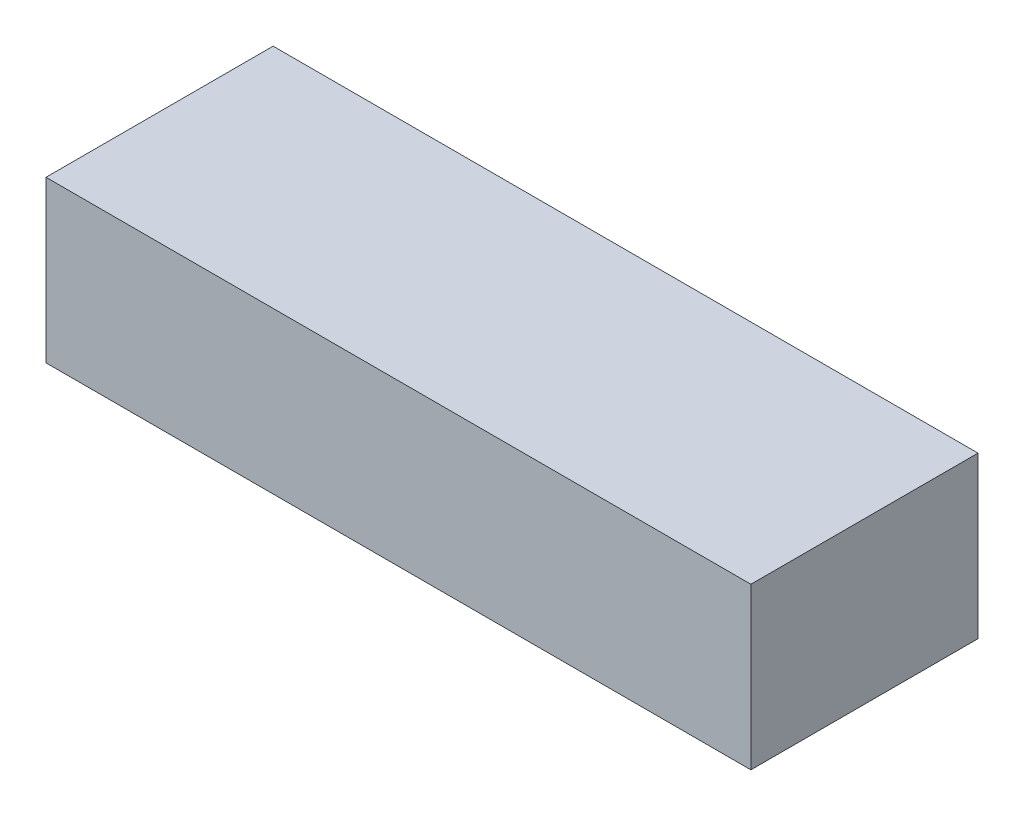
ISO-10303-21;
HEADER;
FILE_DESCRIPTION(('STEP AP214'),'2;1');
FILE_NAME('part.step','',(''),(''),'','','');
FILE_SCHEMA(('AUTOMOTIVE_DESIGN { 1 0 10303 214 1 1 1 1 }'));
ENDSEC;
DATA;
#1=APPLICATION_CONTEXT('core data for automotive mechanical design processes');
#2=APPLICATION_PROTOCOL_DEFINITION('international standard','automotive_design',2000,#1);
#3=PRODUCT_CONTEXT('',#1,'mechanical');
#4=PRODUCT('Part','Part','',(#3));
#5=PRODUCT_RELATED_PRODUCT_CATEGORY('part','',(#4));
#6=PRODUCT_DEFINITION_FORMATION('','',#4);
#7=PRODUCT_DEFINITION_CONTEXT('part definition',#1,'design');
#8=PRODUCT_DEFINITION('design','',#6,#7);
#9=PRODUCT_DEFINITION_SHAPE('','',#8);
#10=(LENGTH_UNIT() NAMED_UNIT(*) SI_UNIT(.MILLI.,.METRE.));
#11=(NAMED_UNIT(*) PLANE_ANGLE_UNIT() SI_UNIT($,.RADIAN.));
#12=(NAMED_UNIT(*) SI_UNIT($,.STERADIAN.) SOLID_ANGLE_UNIT());
#13=UNCERTAINTY_MEASURE_WITH_UNIT(LENGTH_MEASURE(1.E-05),#10,'distance_accuracy_value','');
#14=(GEOMETRIC_REPRESENTATION_CONTEXT(3) GLOBAL_UNCERTAINTY_ASSIGNED_CONTEXT((#13)) GLOBAL_UNIT_ASSIGNED_CONTEXT((#10,
#11,#12)) REPRESENTATION_CONTEXT('',''));
#15=CARTESIAN_POINT('',(0.,0.,0.));
#16=DIRECTION('',(0.,0.,1.));
#17=DIRECTION('',(1.,0.,0.));
#18=AXIS2_PLACEMENT_3D('',#15,#16,#17);
#19=CARTESIAN_POINT('',(67.97,31.,-21.9));
#20=DIRECTION('',(-1.,0.,0.));
#21=DIRECTION('',(0.,0.,1.));
#22=AXIS2_PLACEMENT_3D('',#19,#20,#21);
#23=PLANE('',#22);
#24=DIRECTION('',(0.,0.,-1.));
#25=VECTOR('',#24,1.);
#26=CARTESIAN_POINT('',(67.97,0.,-21.9));
#27=LINE('',#26,#25);
#28=CARTESIAN_POINT('',(67.97,0.,21.9));
#29=VERTEX_POINT('',#28);
#30=CARTESIAN_POINT('',(67.97,0.,-21.9));
#31=VERTEX_POINT('',#30);
#32=EDGE_CURVE('E100',#29,#31,#27,.T.);
#33=ORIENTED_EDGE('',*,*,#32,.T.);
#34=DIRECTION('',(0.,-1.,0.));
#35=VECTOR('',#34,1.);
#36=CARTESIAN_POINT('',(67.97,31.,-21.9));
#37=LINE('',#36,#35);
#38=CARTESIAN_POINT('',(67.97,31.,-21.9));
#39=VERTEX_POINT('',#38);
#40=EDGE_CURVE('E11',#39,#31,#37,.T.);
#41=ORIENTED_EDGE('',*,*,#40,.F.);
#42=DIRECTION('',(0.,0.,-1.));
#43=VECTOR('',#42,1.);
#44=CARTESIAN_POINT('',(67.97,31.,-21.9));
#45=LINE('',#44,#43);
#46=CARTESIAN_POINT('',(67.97,31.,21.9));
#47=VERTEX_POINT('',#46);
#48=EDGE_CURVE('E88',#47,#39,#45,.T.);
#49=ORIENTED_EDGE('',*,*,#48,.F.);
#50=DIRECTION('',(0.,-1.,0.));
#51=VECTOR('',#50,1.);
#52=CARTESIAN_POINT('',(67.97,31.,21.9));
#53=LINE('',#52,#51);
#54=EDGE_CURVE('E96',#47,#29,#53,.T.);
#55=ORIENTED_EDGE('',*,*,#54,.T.);
#56=EDGE_LOOP('',(#33,#41,#49,#55));
#57=FACE_BOUND('',#56,.T.);
#58=ADVANCED_FACE('F37',(#57),#23,.F.);
#59=CARTESIAN_POINT('',(-67.97,31.,-21.9));
#60=DIRECTION('',(0.,0.,1.));
#61=DIRECTION('',(1.,0.,0.));
#62=AXIS2_PLACEMENT_3D('',#59,#60,#61);
#63=PLANE('',#62);
#64=DIRECTION('',(-1.,0.,0.));
#65=VECTOR('',#64,1.);
#66=CARTESIAN_POINT('',(-67.97,0.,-21.9));
#67=LINE('',#66,#65);
#68=CARTESIAN_POINT('',(-67.97,0.,-21.9));
#69=VERTEX_POINT('',#68);
#70=EDGE_CURVE('E92',#31,#69,#67,.T.);
#71=ORIENTED_EDGE('',*,*,#70,.T.);
#72=DIRECTION('',(0.,-1.,0.));
#73=VECTOR('',#72,1.);
#74=CARTESIAN_POINT('',(-67.97,31.,-21.9));
#75=LINE('',#74,#73);
#76=CARTESIAN_POINT('',(-67.97,31.,-21.9));
#77=VERTEX_POINT('',#76);
#78=EDGE_CURVE('E45',#77,#69,#75,.T.);
#79=ORIENTED_EDGE('',*,*,#78,.F.);
#80=DIRECTION('',(-1.,0.,0.));
#81=VECTOR('',#80,1.);
#82=CARTESIAN_POINT('',(-67.97,31.,-21.9));
#83=LINE('',#82,#81);
#84=EDGE_CURVE('E83',#39,#77,#83,.T.);
#85=ORIENTED_EDGE('',*,*,#84,.F.);
#86=ORIENTED_EDGE('',*,*,#40,.T.);
#87=EDGE_LOOP('',(#71,#79,#85,#86));
#88=FACE_BOUND('',#87,.T.);
#89=ADVANCED_FACE('F91',(#88),#63,.F.);
#90=CARTESIAN_POINT('',(-67.97,31.,-21.9));
#91=DIRECTION('',(1.,0.,0.));
#92=DIRECTION('',(0.,0.,-1.));
#93=AXIS2_PLACEMENT_3D('',#90,#91,#92);
#94=PLANE('',#93);
#95=DIRECTION('',(0.,0.,1.));
#96=VECTOR('',#95,1.);
#97=CARTESIAN_POINT('',(-67.97,0.,-21.9));
#98=LINE('',#97,#96);
#99=CARTESIAN_POINT('',(-67.97,0.,21.9));
#100=VERTEX_POINT('',#99);
#101=EDGE_CURVE('E70',#69,#100,#98,.T.);
#102=ORIENTED_EDGE('',*,*,#101,.T.);
#103=DIRECTION('',(0.,-1.,0.));
#104=VECTOR('',#103,1.);
#105=CARTESIAN_POINT('',(-67.97,31.,21.9));
#106=LINE('',#105,#104);
#107=CARTESIAN_POINT('',(-67.97,31.,21.9));
#108=VERTEX_POINT('',#107);
#109=EDGE_CURVE('E93',#108,#100,#106,.T.);
#110=ORIENTED_EDGE('',*,*,#109,.F.);
#111=DIRECTION('',(0.,0.,1.));
#112=VECTOR('',#111,1.);
#113=CARTESIAN_POINT('',(-67.97,31.,-21.9));
#114=LINE('',#113,#112);
#115=EDGE_CURVE('E86',#77,#108,#114,.T.);
#116=ORIENTED_EDGE('',*,*,#115,.F.);
#117=ORIENTED_EDGE('',*,*,#78,.T.);
#118=EDGE_LOOP('',(#102,#110,#116,#117));
#119=FACE_BOUND('',#118,.T.);
#120=ADVANCED_FACE('F94',(#119),#94,.F.);
#121=CARTESIAN_POINT('',(-67.97,31.,21.9));
#122=DIRECTION('',(0.,0.,-1.));
#123=DIRECTION('',(-1.,0.,0.));
#124=AXIS2_PLACEMENT_3D('',#121,#122,#123);
#125=PLANE('',#124);
#126=DIRECTION('',(1.,0.,0.));
#127=VECTOR('',#126,1.);
#128=CARTESIAN_POINT('',(-67.97,0.,21.9));
#129=LINE('',#128,#127);
#130=EDGE_CURVE('E76',#100,#29,#129,.T.);
#131=ORIENTED_EDGE('',*,*,#130,.T.);
#132=ORIENTED_EDGE('',*,*,#54,.F.);
#133=DIRECTION('',(1.,0.,0.));
#134=VECTOR('',#133,1.);
#135=CARTESIAN_POINT('',(-67.97,31.,21.9));
#136=LINE('',#135,#134);
#137=EDGE_CURVE('E53',#108,#47,#136,.T.);
#138=ORIENTED_EDGE('',*,*,#137,.F.);
#139=ORIENTED_EDGE('',*,*,#109,.T.);
#140=EDGE_LOOP('',(#131,#132,#138,#139));
#141=FACE_BOUND('',#140,.T.);
#142=ADVANCED_FACE('F107',(#141),#125,.F.);
#143=CARTESIAN_POINT('',(0.,31.,0.));
#144=DIRECTION('',(0.,1.,0.));
#145=DIRECTION('',(0.,0.,1.));
#146=AXIS2_PLACEMENT_3D('',#143,#144,#145);
#147=PLANE('',#146);
#148=ORIENTED_EDGE('',*,*,#48,.T.);
#149=ORIENTED_EDGE('',*,*,#84,.T.);
#150=ORIENTED_EDGE('',*,*,#115,.T.);
#151=ORIENTED_EDGE('',*,*,#137,.T.);
#152=EDGE_LOOP('',(#148,#149,#150,#151));
#153=FACE_BOUND('',#152,.T.);
#154=ADVANCED_FACE('F84',(#153),#147,.T.);
#155=CARTESIAN_POINT('',(0.,0.,0.));
#156=DIRECTION('',(0.,1.,0.));
#157=DIRECTION('',(0.,0.,1.));
#158=AXIS2_PLACEMENT_3D('',#155,#156,#157);
#159=PLANE('',#158);
#160=ORIENTED_EDGE('',*,*,#32,.F.);
#161=ORIENTED_EDGE('',*,*,#130,.F.);
#162=ORIENTED_EDGE('',*,*,#101,.F.);
#163=ORIENTED_EDGE('',*,*,#70,.F.);
#164=EDGE_LOOP('',(#160,#161,#162,#163));
#165=FACE_BOUND('',#164,.T.);
#166=ADVANCED_FACE('F110',(#165),#159,.F.);
#167=CLOSED_SHELL('',(#58,#89,#120,#142,#154,#166));
#168=MANIFOLD_SOLID_BREP('B2',#167);
#169=ADVANCED_BREP_SHAPE_REPRESENTATION('',(#18,#168),#14);
#170=SHAPE_DEFINITION_REPRESENTATION(#9,#169);
ENDSEC;
END-ISO-10303-21;
